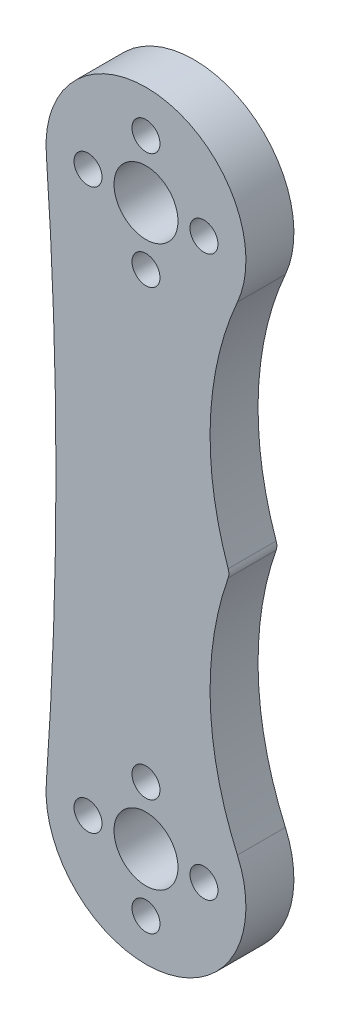
ISO-10303-21;
HEADER;
FILE_DESCRIPTION(('STEP AP214'),'2;1');
FILE_NAME('part.step','',(''),(''),'','','');
FILE_SCHEMA(('AUTOMOTIVE_DESIGN { 1 0 10303 214 1 1 1 1 }'));
ENDSEC;
DATA;
#1=APPLICATION_CONTEXT('core data for automotive mechanical design processes');
#2=APPLICATION_PROTOCOL_DEFINITION('international standard','automotive_design',2000,#1);
#3=PRODUCT_CONTEXT('',#1,'mechanical');
#4=PRODUCT('Part','Part','',(#3));
#5=PRODUCT_RELATED_PRODUCT_CATEGORY('part','',(#4));
#6=PRODUCT_DEFINITION_FORMATION('','',#4);
#7=PRODUCT_DEFINITION_CONTEXT('part definition',#1,'design');
#8=PRODUCT_DEFINITION('design','',#6,#7);
#9=PRODUCT_DEFINITION_SHAPE('','',#8);
#10=(LENGTH_UNIT() NAMED_UNIT(*) SI_UNIT(.MILLI.,.METRE.));
#11=(NAMED_UNIT(*) PLANE_ANGLE_UNIT() SI_UNIT($,.RADIAN.));
#12=(NAMED_UNIT(*) SI_UNIT($,.STERADIAN.) SOLID_ANGLE_UNIT());
#13=UNCERTAINTY_MEASURE_WITH_UNIT(LENGTH_MEASURE(1.E-05),#10,'distance_accuracy_value','');
#14=(GEOMETRIC_REPRESENTATION_CONTEXT(3) GLOBAL_UNCERTAINTY_ASSIGNED_CONTEXT((#13)) GLOBAL_UNIT_ASSIGNED_CONTEXT((#10,
#11,#12)) REPRESENTATION_CONTEXT('',''));
#15=CARTESIAN_POINT('',(0.,0.,0.));
#16=DIRECTION('',(0.,0.,1.));
#17=DIRECTION('',(1.,0.,0.));
#18=AXIS2_PLACEMENT_3D('',#15,#16,#17);
#19=CARTESIAN_POINT('',(-492.458190266202,35.,6.));
#20=DIRECTION('',(0.,0.,-1.));
#21=DIRECTION('',(-1.,0.,0.));
#22=AXIS2_PLACEMENT_3D('',#19,#20,#21);
#23=CYLINDRICAL_SURFACE('',#22,481.200383998497);
#24=CARTESIAN_POINT('',(-492.458190266202,35.,0.));
#25=DIRECTION('',(0.,0.,1.));
#26=DIRECTION('',(1.,0.,0.));
#27=AXIS2_PLACEMENT_3D('',#24,#25,#26);
#28=CIRCLE('',#27,481.200383998497);
#29=CARTESIAN_POINT('',(-12.4685488969485,0.886164998407885,0.));
#30=VERTEX_POINT('',#29);
#31=CARTESIAN_POINT('',(-12.4685488969485,69.1138350015921,0.));
#32=VERTEX_POINT('',#31);
#33=EDGE_CURVE('E115',#30,#32,#28,.T.);
#34=ORIENTED_EDGE('',*,*,#33,.F.);
#35=DIRECTION('',(0.,0.,-1.));
#36=VECTOR('',#35,1.);
#37=CARTESIAN_POINT('',(-12.4685488969485,0.886164998407885,6.));
#38=LINE('',#37,#36);
#39=CARTESIAN_POINT('',(-12.4685488969485,0.886164998407885,6.));
#40=VERTEX_POINT('',#39);
#41=EDGE_CURVE('E11',#40,#30,#38,.T.);
#42=ORIENTED_EDGE('',*,*,#41,.F.);
#43=CARTESIAN_POINT('',(-492.458190266202,35.,6.));
#44=DIRECTION('',(0.,0.,1.));
#45=DIRECTION('',(1.,0.,0.));
#46=AXIS2_PLACEMENT_3D('',#43,#44,#45);
#47=CIRCLE('',#46,481.200383998497);
#48=CARTESIAN_POINT('',(-12.4685488969485,69.1138350015921,6.));
#49=VERTEX_POINT('',#48);
#50=EDGE_CURVE('E130',#40,#49,#47,.T.);
#51=ORIENTED_EDGE('',*,*,#50,.T.);
#52=DIRECTION('',(0.,0.,-1.));
#53=VECTOR('',#52,1.);
#54=CARTESIAN_POINT('',(-12.4685488969485,69.1138350015921,6.));
#55=LINE('',#54,#53);
#56=EDGE_CURVE('E78',#49,#32,#55,.T.);
#57=ORIENTED_EDGE('',*,*,#56,.T.);
#58=EDGE_LOOP('',(#34,#42,#51,#57));
#59=FACE_BOUND('',#58,.T.);
#60=ADVANCED_FACE('F34',(#59),#23,.F.);
#61=CARTESIAN_POINT('',(0.,0.,6.));
#62=DIRECTION('',(0.,0.,-1.));
#63=DIRECTION('',(-1.,0.,0.));
#64=AXIS2_PLACEMENT_3D('',#61,#62,#63);
#65=CYLINDRICAL_SURFACE('',#64,12.5);
#66=CARTESIAN_POINT('',(0.,0.,0.));
#67=DIRECTION('',(0.,0.,1.));
#68=DIRECTION('',(1.,0.,0.));
#69=AXIS2_PLACEMENT_3D('',#66,#67,#68);
#70=CIRCLE('',#69,12.5);
#71=CARTESIAN_POINT('',(11.432131406701,5.05533099805747,0.));
#72=VERTEX_POINT('',#71);
#73=EDGE_CURVE('E118',#30,#72,#70,.T.);
#74=ORIENTED_EDGE('',*,*,#73,.T.);
#75=DIRECTION('',(0.,0.,-1.));
#76=VECTOR('',#75,1.);
#77=CARTESIAN_POINT('',(11.432131406701,5.05533099805747,6.));
#78=LINE('',#77,#76);
#79=CARTESIAN_POINT('',(11.432131406701,5.05533099805747,6.));
#80=VERTEX_POINT('',#79);
#81=EDGE_CURVE('E42',#80,#72,#78,.T.);
#82=ORIENTED_EDGE('',*,*,#81,.F.);
#83=CARTESIAN_POINT('',(0.,0.,6.));
#84=DIRECTION('',(0.,0.,1.));
#85=DIRECTION('',(1.,0.,0.));
#86=AXIS2_PLACEMENT_3D('',#83,#84,#85);
#87=CIRCLE('',#86,12.5);
#88=EDGE_CURVE('E143',#40,#80,#87,.T.);
#89=ORIENTED_EDGE('',*,*,#88,.F.);
#90=ORIENTED_EDGE('',*,*,#41,.T.);
#91=EDGE_LOOP('',(#74,#82,#89,#90));
#92=FACE_BOUND('',#91,.T.);
#93=ADVANCED_FACE('F139',(#92),#65,.T.);
#94=CARTESIAN_POINT('',(48.0149519081442,21.2323901918414,6.));
#95=DIRECTION('',(0.,0.,-1.));
#96=DIRECTION('',(-1.,0.,0.));
#97=AXIS2_PLACEMENT_3D('',#94,#95,#96);
#98=CYLINDRICAL_SURFACE('',#97,40.);
#99=CARTESIAN_POINT('',(48.0149519081442,21.2323901918414,0.));
#100=DIRECTION('',(0.,0.,1.));
#101=DIRECTION('',(1.,0.,0.));
#102=AXIS2_PLACEMENT_3D('',#99,#100,#101);
#103=CIRCLE('',#102,40.);
#104=CARTESIAN_POINT('',(10.2802531731858,34.5023755491027,0.));
#105=VERTEX_POINT('',#104);
#106=EDGE_CURVE('E122',#105,#72,#103,.T.);
#107=ORIENTED_EDGE('',*,*,#106,.F.);
#108=DIRECTION('',(0.,0.,-1.));
#109=VECTOR('',#108,1.);
#110=CARTESIAN_POINT('',(10.2802531731858,34.5023755491027,6.));
#111=LINE('',#110,#109);
#112=CARTESIAN_POINT('',(10.2802531731858,34.5023755491027,6.));
#113=VERTEX_POINT('',#112);
#114=EDGE_CURVE('E108',#113,#105,#111,.T.);
#115=ORIENTED_EDGE('',*,*,#114,.F.);
#116=CARTESIAN_POINT('',(48.0149519081442,21.2323901918414,6.));
#117=DIRECTION('',(0.,0.,1.));
#118=DIRECTION('',(1.,0.,0.));
#119=AXIS2_PLACEMENT_3D('',#116,#117,#118);
#120=CIRCLE('',#119,40.);
#121=EDGE_CURVE('E97',#113,#80,#120,.T.);
#122=ORIENTED_EDGE('',*,*,#121,.T.);
#123=ORIENTED_EDGE('',*,*,#81,.T.);
#124=EDGE_LOOP('',(#107,#115,#122,#123));
#125=FACE_BOUND('',#124,.T.);
#126=ADVANCED_FACE('F136',(#125),#98,.F.);
#127=CARTESIAN_POINT('',(8.86520197062487,35.,6.));
#128=DIRECTION('',(0.,0.,-1.));
#129=DIRECTION('',(-1.,0.,0.));
#130=AXIS2_PLACEMENT_3D('',#127,#128,#129);
#131=CYLINDRICAL_SURFACE('',#130,1.5);
#132=CARTESIAN_POINT('',(8.86520197062487,35.,0.));
#133=DIRECTION('',(0.,0.,1.));
#134=DIRECTION('',(1.,0.,0.));
#135=AXIS2_PLACEMENT_3D('',#132,#133,#134);
#136=CIRCLE('',#135,1.5);
#137=CARTESIAN_POINT('',(10.2802531731858,35.4976244508973,0.));
#138=VERTEX_POINT('',#137);
#139=EDGE_CURVE('E104',#105,#138,#136,.T.);
#140=ORIENTED_EDGE('',*,*,#139,.T.);
#141=DIRECTION('',(0.,0.,-1.));
#142=VECTOR('',#141,1.);
#143=CARTESIAN_POINT('',(10.2802531731858,35.4976244508973,6.));
#144=LINE('',#143,#142);
#145=CARTESIAN_POINT('',(10.2802531731858,35.4976244508973,6.));
#146=VERTEX_POINT('',#145);
#147=EDGE_CURVE('E101',#146,#138,#144,.T.);
#148=ORIENTED_EDGE('',*,*,#147,.F.);
#149=CARTESIAN_POINT('',(8.86520197062487,35.,6.));
#150=DIRECTION('',(0.,0.,1.));
#151=DIRECTION('',(1.,0.,0.));
#152=AXIS2_PLACEMENT_3D('',#149,#150,#151);
#153=CIRCLE('',#152,1.5);
#154=EDGE_CURVE('E91',#113,#146,#153,.T.);
#155=ORIENTED_EDGE('',*,*,#154,.F.);
#156=ORIENTED_EDGE('',*,*,#114,.T.);
#157=EDGE_LOOP('',(#140,#148,#155,#156));
#158=FACE_BOUND('',#157,.T.);
#159=ADVANCED_FACE('F102',(#158),#131,.T.);
#160=CARTESIAN_POINT('',(48.0149519081442,48.7676098081586,6.));
#161=DIRECTION('',(0.,0.,-1.));
#162=DIRECTION('',(-1.,0.,0.));
#163=AXIS2_PLACEMENT_3D('',#160,#161,#162);
#164=CYLINDRICAL_SURFACE('',#163,40.);
#165=CARTESIAN_POINT('',(48.0149519081442,48.7676098081586,0.));
#166=DIRECTION('',(0.,0.,1.));
#167=DIRECTION('',(1.,0.,0.));
#168=AXIS2_PLACEMENT_3D('',#165,#166,#167);
#169=CIRCLE('',#168,40.);
#170=CARTESIAN_POINT('',(11.432131406701,64.9446690019425,0.));
#171=VERTEX_POINT('',#170);
#172=EDGE_CURVE('E126',#171,#138,#169,.T.);
#173=ORIENTED_EDGE('',*,*,#172,.F.);
#174=DIRECTION('',(0.,0.,-1.));
#175=VECTOR('',#174,1.);
#176=CARTESIAN_POINT('',(11.432131406701,64.9446690019425,6.));
#177=LINE('',#176,#175);
#178=CARTESIAN_POINT('',(11.432131406701,64.9446690019425,6.));
#179=VERTEX_POINT('',#178);
#180=EDGE_CURVE('E71',#179,#171,#177,.T.);
#181=ORIENTED_EDGE('',*,*,#180,.F.);
#182=CARTESIAN_POINT('',(48.0149519081442,48.7676098081586,6.));
#183=DIRECTION('',(0.,0.,1.));
#184=DIRECTION('',(1.,0.,0.));
#185=AXIS2_PLACEMENT_3D('',#182,#183,#184);
#186=CIRCLE('',#185,40.);
#187=EDGE_CURVE('E95',#179,#146,#186,.T.);
#188=ORIENTED_EDGE('',*,*,#187,.T.);
#189=ORIENTED_EDGE('',*,*,#147,.T.);
#190=EDGE_LOOP('',(#173,#181,#188,#189));
#191=FACE_BOUND('',#190,.T.);
#192=ADVANCED_FACE('F110',(#191),#164,.F.);
#193=CARTESIAN_POINT('',(0.,70.,6.));
#194=DIRECTION('',(0.,0.,-1.));
#195=DIRECTION('',(-1.,0.,0.));
#196=AXIS2_PLACEMENT_3D('',#193,#194,#195);
#197=CYLINDRICAL_SURFACE('',#196,12.5);
#198=CARTESIAN_POINT('',(0.,70.,0.));
#199=DIRECTION('',(0.,0.,1.));
#200=DIRECTION('',(1.,0.,0.));
#201=AXIS2_PLACEMENT_3D('',#198,#199,#200);
#202=CIRCLE('',#201,12.5);
#203=EDGE_CURVE('E128',#171,#32,#202,.T.);
#204=ORIENTED_EDGE('',*,*,#203,.T.);
#205=ORIENTED_EDGE('',*,*,#56,.F.);
#206=CARTESIAN_POINT('',(0.,70.,6.));
#207=DIRECTION('',(0.,0.,1.));
#208=DIRECTION('',(1.,0.,0.));
#209=AXIS2_PLACEMENT_3D('',#206,#207,#208);
#210=CIRCLE('',#209,12.5);
#211=EDGE_CURVE('E50',#179,#49,#210,.T.);
#212=ORIENTED_EDGE('',*,*,#211,.F.);
#213=ORIENTED_EDGE('',*,*,#180,.T.);
#214=EDGE_LOOP('',(#204,#205,#212,#213));
#215=FACE_BOUND('',#214,.T.);
#216=ADVANCED_FACE('F142',(#215),#197,.T.);
#217=CARTESIAN_POINT('',(0.,0.,6.));
#218=DIRECTION('',(0.,0.,1.));
#219=DIRECTION('',(1.,0.,0.));
#220=AXIS2_PLACEMENT_3D('',#217,#218,#219);
#221=PLANE('',#220);
#222=CARTESIAN_POINT('',(0.,62.75,6.));
#223=DIRECTION('',(0.,0.,1.));
#224=DIRECTION('',(1.,0.,0.));
#225=AXIS2_PLACEMENT_3D('',#222,#223,#224);
#226=CIRCLE('',#225,1.75);
#227=CARTESIAN_POINT('',(1.75,62.75,6.));
#228=VERTEX_POINT('',#227);
#229=EDGE_CURVE('E177',#228,#228,#226,.T.);
#230=ORIENTED_EDGE('',*,*,#229,.F.);
#231=EDGE_LOOP('',(#230));
#232=FACE_BOUND('',#231,.T.);
#233=CARTESIAN_POINT('',(7.25000000000001,70.,6.));
#234=DIRECTION('',(0.,0.,1.));
#235=DIRECTION('',(1.,0.,0.));
#236=AXIS2_PLACEMENT_3D('',#233,#234,#235);
#237=CIRCLE('',#236,1.75);
#238=CARTESIAN_POINT('',(9.00000000000001,70.,6.));
#239=VERTEX_POINT('',#238);
#240=EDGE_CURVE('E184',#239,#239,#237,.T.);
#241=ORIENTED_EDGE('',*,*,#240,.F.);
#242=EDGE_LOOP('',(#241));
#243=FACE_BOUND('',#242,.T.);
#244=CARTESIAN_POINT('',(-7.2499999999998,-2.06057393370429E-13,6.));
#245=DIRECTION('',(0.,0.,1.));
#246=DIRECTION('',(1.,0.,0.));
#247=AXIS2_PLACEMENT_3D('',#244,#245,#246);
#248=CIRCLE('',#247,1.75);
#249=CARTESIAN_POINT('',(-5.4999999999998,-2.06057393370429E-13,6.));
#250=VERTEX_POINT('',#249);
#251=EDGE_CURVE('E190',#250,#250,#248,.T.);
#252=ORIENTED_EDGE('',*,*,#251,.F.);
#253=EDGE_LOOP('',(#252));
#254=FACE_BOUND('',#253,.T.);
#255=CARTESIAN_POINT('',(4.10339048882094E-13,-7.25,6.));
#256=DIRECTION('',(0.,0.,1.));
#257=DIRECTION('',(1.,0.,0.));
#258=AXIS2_PLACEMENT_3D('',#255,#256,#257);
#259=CIRCLE('',#258,1.75);
#260=CARTESIAN_POINT('',(1.75000000000041,-7.25,6.));
#261=VERTEX_POINT('',#260);
#262=EDGE_CURVE('E196',#261,#261,#259,.T.);
#263=ORIENTED_EDGE('',*,*,#262,.F.);
#264=EDGE_LOOP('',(#263));
#265=FACE_BOUND('',#264,.T.);
#266=CARTESIAN_POINT('',(0.,0.,6.));
#267=DIRECTION('',(0.,0.,1.));
#268=DIRECTION('',(1.,0.,0.));
#269=AXIS2_PLACEMENT_3D('',#266,#267,#268);
#270=CIRCLE('',#269,4.);
#271=CARTESIAN_POINT('',(4.,0.,6.));
#272=VERTEX_POINT('',#271);
#273=EDGE_CURVE('E160',#272,#272,#270,.T.);
#274=ORIENTED_EDGE('',*,*,#273,.F.);
#275=EDGE_LOOP('',(#274));
#276=FACE_BOUND('',#275,.T.);
#277=CARTESIAN_POINT('',(0.,7.25,6.));
#278=DIRECTION('',(0.,0.,1.));
#279=DIRECTION('',(1.,0.,0.));
#280=AXIS2_PLACEMENT_3D('',#277,#278,#279);
#281=CIRCLE('',#280,1.75);
#282=CARTESIAN_POINT('',(1.75,7.25,6.));
#283=VERTEX_POINT('',#282);
#284=EDGE_CURVE('E153',#283,#283,#281,.T.);
#285=ORIENTED_EDGE('',*,*,#284,.F.);
#286=EDGE_LOOP('',(#285));
#287=FACE_BOUND('',#286,.T.);
#288=CARTESIAN_POINT('',(0.,77.25,6.));
#289=DIRECTION('',(0.,0.,1.));
#290=DIRECTION('',(1.,0.,0.));
#291=AXIS2_PLACEMENT_3D('',#288,#289,#290);
#292=CIRCLE('',#291,1.75);
#293=CARTESIAN_POINT('',(1.75,77.25,6.));
#294=VERTEX_POINT('',#293);
#295=EDGE_CURVE('E172',#294,#294,#292,.T.);
#296=ORIENTED_EDGE('',*,*,#295,.F.);
#297=EDGE_LOOP('',(#296));
#298=FACE_BOUND('',#297,.T.);
#299=CARTESIAN_POINT('',(7.25000000000021,2.05169524441047E-13,6.));
#300=DIRECTION('',(0.,0.,1.));
#301=DIRECTION('',(1.,0.,0.));
#302=AXIS2_PLACEMENT_3D('',#299,#300,#301);
#303=CIRCLE('',#302,1.75);
#304=CARTESIAN_POINT('',(9.00000000000021,2.05169524441047E-13,6.));
#305=VERTEX_POINT('',#304);
#306=EDGE_CURVE('E165',#305,#305,#303,.T.);
#307=ORIENTED_EDGE('',*,*,#306,.F.);
#308=EDGE_LOOP('',(#307));
#309=FACE_BOUND('',#308,.T.);
#310=CARTESIAN_POINT('',(-7.25000000000001,70.,6.));
#311=DIRECTION('',(0.,0.,1.));
#312=DIRECTION('',(1.,0.,0.));
#313=AXIS2_PLACEMENT_3D('',#310,#311,#312);
#314=CIRCLE('',#313,1.75);
#315=CARTESIAN_POINT('',(-5.50000000000001,70.,6.));
#316=VERTEX_POINT('',#315);
#317=EDGE_CURVE('E201',#316,#316,#314,.T.);
#318=ORIENTED_EDGE('',*,*,#317,.F.);
#319=EDGE_LOOP('',(#318));
#320=FACE_BOUND('',#319,.T.);
#321=CARTESIAN_POINT('',(0.,70.,6.));
#322=DIRECTION('',(0.,0.,1.));
#323=DIRECTION('',(1.,0.,0.));
#324=AXIS2_PLACEMENT_3D('',#321,#322,#323);
#325=CIRCLE('',#324,4.);
#326=CARTESIAN_POINT('',(4.,70.,6.));
#327=VERTEX_POINT('',#326);
#328=EDGE_CURVE('E147',#327,#327,#325,.T.);
#329=ORIENTED_EDGE('',*,*,#328,.F.);
#330=EDGE_LOOP('',(#329));
#331=FACE_BOUND('',#330,.T.);
#332=ORIENTED_EDGE('',*,*,#50,.F.);
#333=ORIENTED_EDGE('',*,*,#88,.T.);
#334=ORIENTED_EDGE('',*,*,#121,.F.);
#335=ORIENTED_EDGE('',*,*,#154,.T.);
#336=ORIENTED_EDGE('',*,*,#187,.F.);
#337=ORIENTED_EDGE('',*,*,#211,.T.);
#338=EDGE_LOOP('',(#332,#333,#334,#335,#336,#337));
#339=FACE_BOUND('',#338,.T.);
#340=ADVANCED_FACE('F93',(#232,#243,#254,#265,#276,#287,#298,#309,#320,#331,#339),#221,.T.);
#341=CARTESIAN_POINT('',(0.,0.,0.));
#342=DIRECTION('',(0.,0.,1.));
#343=DIRECTION('',(1.,0.,0.));
#344=AXIS2_PLACEMENT_3D('',#341,#342,#343);
#345=PLANE('',#344);
#346=CARTESIAN_POINT('',(0.,62.75,0.));
#347=DIRECTION('',(0.,0.,1.));
#348=DIRECTION('',(1.,0.,0.));
#349=AXIS2_PLACEMENT_3D('',#346,#347,#348);
#350=CIRCLE('',#349,1.75);
#351=CARTESIAN_POINT('',(1.75,62.75,0.));
#352=VERTEX_POINT('',#351);
#353=EDGE_CURVE('E180',#352,#352,#350,.T.);
#354=ORIENTED_EDGE('',*,*,#353,.T.);
#355=EDGE_LOOP('',(#354));
#356=FACE_BOUND('',#355,.T.);
#357=CARTESIAN_POINT('',(7.25000000000001,70.,0.));
#358=DIRECTION('',(0.,0.,1.));
#359=DIRECTION('',(1.,0.,0.));
#360=AXIS2_PLACEMENT_3D('',#357,#358,#359);
#361=CIRCLE('',#360,1.75);
#362=CARTESIAN_POINT('',(9.00000000000001,70.,0.));
#363=VERTEX_POINT('',#362);
#364=EDGE_CURVE('E187',#363,#363,#361,.T.);
#365=ORIENTED_EDGE('',*,*,#364,.T.);
#366=EDGE_LOOP('',(#365));
#367=FACE_BOUND('',#366,.T.);
#368=CARTESIAN_POINT('',(-7.2499999999998,-2.06057393370429E-13,0.));
#369=DIRECTION('',(0.,0.,1.));
#370=DIRECTION('',(1.,0.,0.));
#371=AXIS2_PLACEMENT_3D('',#368,#369,#370);
#372=CIRCLE('',#371,1.75);
#373=CARTESIAN_POINT('',(-5.4999999999998,-2.06057393370429E-13,0.));
#374=VERTEX_POINT('',#373);
#375=EDGE_CURVE('E193',#374,#374,#372,.T.);
#376=ORIENTED_EDGE('',*,*,#375,.T.);
#377=EDGE_LOOP('',(#376));
#378=FACE_BOUND('',#377,.T.);
#379=CARTESIAN_POINT('',(4.10339048882094E-13,-7.25,0.));
#380=DIRECTION('',(0.,0.,1.));
#381=DIRECTION('',(1.,0.,0.));
#382=AXIS2_PLACEMENT_3D('',#379,#380,#381);
#383=CIRCLE('',#382,1.75);
#384=CARTESIAN_POINT('',(1.75000000000041,-7.25,0.));
#385=VERTEX_POINT('',#384);
#386=EDGE_CURVE('E169',#385,#385,#383,.T.);
#387=ORIENTED_EDGE('',*,*,#386,.T.);
#388=EDGE_LOOP('',(#387));
#389=FACE_BOUND('',#388,.T.);
#390=CARTESIAN_POINT('',(0.,0.,0.));
#391=DIRECTION('',(0.,0.,1.));
#392=DIRECTION('',(1.,0.,0.));
#393=AXIS2_PLACEMENT_3D('',#390,#391,#392);
#394=CIRCLE('',#393,4.);
#395=CARTESIAN_POINT('',(4.,0.,0.));
#396=VERTEX_POINT('',#395);
#397=EDGE_CURVE('E150',#396,#396,#394,.T.);
#398=ORIENTED_EDGE('',*,*,#397,.T.);
#399=EDGE_LOOP('',(#398));
#400=FACE_BOUND('',#399,.T.);
#401=CARTESIAN_POINT('',(0.,7.25,0.));
#402=DIRECTION('',(0.,0.,1.));
#403=DIRECTION('',(1.,0.,0.));
#404=AXIS2_PLACEMENT_3D('',#401,#402,#403);
#405=CIRCLE('',#404,1.75);
#406=CARTESIAN_POINT('',(1.75,7.25,0.));
#407=VERTEX_POINT('',#406);
#408=EDGE_CURVE('E156',#407,#407,#405,.T.);
#409=ORIENTED_EDGE('',*,*,#408,.T.);
#410=EDGE_LOOP('',(#409));
#411=FACE_BOUND('',#410,.T.);
#412=CARTESIAN_POINT('',(0.,77.25,0.));
#413=DIRECTION('',(0.,0.,1.));
#414=DIRECTION('',(1.,0.,0.));
#415=AXIS2_PLACEMENT_3D('',#412,#413,#414);
#416=CIRCLE('',#415,1.75);
#417=CARTESIAN_POINT('',(1.75,77.25,0.));
#418=VERTEX_POINT('',#417);
#419=EDGE_CURVE('E157',#418,#418,#416,.T.);
#420=ORIENTED_EDGE('',*,*,#419,.T.);
#421=EDGE_LOOP('',(#420));
#422=FACE_BOUND('',#421,.T.);
#423=CARTESIAN_POINT('',(7.25000000000021,2.05169524441047E-13,0.));
#424=DIRECTION('',(0.,0.,1.));
#425=DIRECTION('',(1.,0.,0.));
#426=AXIS2_PLACEMENT_3D('',#423,#424,#425);
#427=CIRCLE('',#426,1.75);
#428=CARTESIAN_POINT('',(9.00000000000021,2.05169524441047E-13,0.));
#429=VERTEX_POINT('',#428);
#430=EDGE_CURVE('E168',#429,#429,#427,.T.);
#431=ORIENTED_EDGE('',*,*,#430,.T.);
#432=EDGE_LOOP('',(#431));
#433=FACE_BOUND('',#432,.T.);
#434=CARTESIAN_POINT('',(-7.25000000000001,70.,0.));
#435=DIRECTION('',(0.,0.,1.));
#436=DIRECTION('',(1.,0.,0.));
#437=AXIS2_PLACEMENT_3D('',#434,#435,#436);
#438=CIRCLE('',#437,1.75);
#439=CARTESIAN_POINT('',(-5.50000000000001,70.,0.));
#440=VERTEX_POINT('',#439);
#441=EDGE_CURVE('E181',#440,#440,#438,.T.);
#442=ORIENTED_EDGE('',*,*,#441,.T.);
#443=EDGE_LOOP('',(#442));
#444=FACE_BOUND('',#443,.T.);
#445=CARTESIAN_POINT('',(0.,70.,0.));
#446=DIRECTION('',(0.,0.,1.));
#447=DIRECTION('',(1.,0.,0.));
#448=AXIS2_PLACEMENT_3D('',#445,#446,#447);
#449=CIRCLE('',#448,4.);
#450=CARTESIAN_POINT('',(4.,70.,0.));
#451=VERTEX_POINT('',#450);
#452=EDGE_CURVE('E119',#451,#451,#449,.T.);
#453=ORIENTED_EDGE('',*,*,#452,.T.);
#454=EDGE_LOOP('',(#453));
#455=FACE_BOUND('',#454,.T.);
#456=ORIENTED_EDGE('',*,*,#33,.T.);
#457=ORIENTED_EDGE('',*,*,#203,.F.);
#458=ORIENTED_EDGE('',*,*,#172,.T.);
#459=ORIENTED_EDGE('',*,*,#139,.F.);
#460=ORIENTED_EDGE('',*,*,#106,.T.);
#461=ORIENTED_EDGE('',*,*,#73,.F.);
#462=EDGE_LOOP('',(#456,#457,#458,#459,#460,#461));
#463=FACE_BOUND('',#462,.T.);
#464=ADVANCED_FACE('F141',(#356,#367,#378,#389,#400,#411,#422,#433,#444,#455,#463),#345,.F.);
#465=CARTESIAN_POINT('',(0.,70.,0.));
#466=DIRECTION('',(0.,0.,1.));
#467=DIRECTION('',(1.,0.,0.));
#468=AXIS2_PLACEMENT_3D('',#465,#466,#467);
#469=CYLINDRICAL_SURFACE('',#468,4.);
#470=ORIENTED_EDGE('',*,*,#452,.F.);
#471=EDGE_LOOP('',(#470));
#472=FACE_BOUND('',#471,.T.);
#473=ORIENTED_EDGE('',*,*,#328,.T.);
#474=EDGE_LOOP('',(#473));
#475=FACE_BOUND('',#474,.T.);
#476=ADVANCED_FACE('F213',(#472,#475),#469,.F.);
#477=CARTESIAN_POINT('',(-7.25000000000001,70.,0.));
#478=DIRECTION('',(0.,0.,1.));
#479=DIRECTION('',(1.,0.,0.));
#480=AXIS2_PLACEMENT_3D('',#477,#478,#479);
#481=CYLINDRICAL_SURFACE('',#480,1.75);
#482=ORIENTED_EDGE('',*,*,#441,.F.);
#483=EDGE_LOOP('',(#482));
#484=FACE_BOUND('',#483,.T.);
#485=ORIENTED_EDGE('',*,*,#317,.T.);
#486=EDGE_LOOP('',(#485));
#487=FACE_BOUND('',#486,.T.);
#488=ADVANCED_FACE('F209',(#484,#487),#481,.F.);
#489=CARTESIAN_POINT('',(7.25000000000021,2.05169524441047E-13,0.));
#490=DIRECTION('',(0.,0.,1.));
#491=DIRECTION('',(1.,0.,0.));
#492=AXIS2_PLACEMENT_3D('',#489,#490,#491);
#493=CYLINDRICAL_SURFACE('',#492,1.75);
#494=ORIENTED_EDGE('',*,*,#430,.F.);
#495=EDGE_LOOP('',(#494));
#496=FACE_BOUND('',#495,.T.);
#497=ORIENTED_EDGE('',*,*,#306,.T.);
#498=EDGE_LOOP('',(#497));
#499=FACE_BOUND('',#498,.T.);
#500=ADVANCED_FACE('F212',(#496,#499),#493,.F.);
#501=CARTESIAN_POINT('',(0.,77.25,0.));
#502=DIRECTION('',(0.,0.,1.));
#503=DIRECTION('',(1.,0.,0.));
#504=AXIS2_PLACEMENT_3D('',#501,#502,#503);
#505=CYLINDRICAL_SURFACE('',#504,1.75);
#506=ORIENTED_EDGE('',*,*,#419,.F.);
#507=EDGE_LOOP('',(#506));
#508=FACE_BOUND('',#507,.T.);
#509=ORIENTED_EDGE('',*,*,#295,.T.);
#510=EDGE_LOOP('',(#509));
#511=FACE_BOUND('',#510,.T.);
#512=ADVANCED_FACE('F279',(#508,#511),#505,.F.);
#513=CARTESIAN_POINT('',(0.,7.25,0.));
#514=DIRECTION('',(0.,0.,1.));
#515=DIRECTION('',(1.,0.,0.));
#516=AXIS2_PLACEMENT_3D('',#513,#514,#515);
#517=CYLINDRICAL_SURFACE('',#516,1.75);
#518=ORIENTED_EDGE('',*,*,#408,.F.);
#519=EDGE_LOOP('',(#518));
#520=FACE_BOUND('',#519,.T.);
#521=ORIENTED_EDGE('',*,*,#284,.T.);
#522=EDGE_LOOP('',(#521));
#523=FACE_BOUND('',#522,.T.);
#524=ADVANCED_FACE('F289',(#520,#523),#517,.F.);
#525=CARTESIAN_POINT('',(0.,0.,0.));
#526=DIRECTION('',(0.,0.,1.));
#527=DIRECTION('',(1.,0.,0.));
#528=AXIS2_PLACEMENT_3D('',#525,#526,#527);
#529=CYLINDRICAL_SURFACE('',#528,4.);
#530=ORIENTED_EDGE('',*,*,#397,.F.);
#531=EDGE_LOOP('',(#530));
#532=FACE_BOUND('',#531,.T.);
#533=ORIENTED_EDGE('',*,*,#273,.T.);
#534=EDGE_LOOP('',(#533));
#535=FACE_BOUND('',#534,.T.);
#536=ADVANCED_FACE('F299',(#532,#535),#529,.F.);
#537=CARTESIAN_POINT('',(4.10339048882094E-13,-7.25,0.));
#538=DIRECTION('',(0.,0.,1.));
#539=DIRECTION('',(1.,0.,0.));
#540=AXIS2_PLACEMENT_3D('',#537,#538,#539);
#541=CYLINDRICAL_SURFACE('',#540,1.75);
#542=ORIENTED_EDGE('',*,*,#386,.F.);
#543=EDGE_LOOP('',(#542));
#544=FACE_BOUND('',#543,.T.);
#545=ORIENTED_EDGE('',*,*,#262,.T.);
#546=EDGE_LOOP('',(#545));
#547=FACE_BOUND('',#546,.T.);
#548=ADVANCED_FACE('F308',(#544,#547),#541,.F.);
#549=CARTESIAN_POINT('',(-7.2499999999998,-2.06057393370429E-13,0.));
#550=DIRECTION('',(0.,0.,1.));
#551=DIRECTION('',(1.,0.,0.));
#552=AXIS2_PLACEMENT_3D('',#549,#550,#551);
#553=CYLINDRICAL_SURFACE('',#552,1.75);
#554=ORIENTED_EDGE('',*,*,#375,.F.);
#555=EDGE_LOOP('',(#554));
#556=FACE_BOUND('',#555,.T.);
#557=ORIENTED_EDGE('',*,*,#251,.T.);
#558=EDGE_LOOP('',(#557));
#559=FACE_BOUND('',#558,.T.);
#560=ADVANCED_FACE('F318',(#556,#559),#553,.F.);
#561=CARTESIAN_POINT('',(7.25000000000001,70.,0.));
#562=DIRECTION('',(0.,0.,1.));
#563=DIRECTION('',(1.,0.,0.));
#564=AXIS2_PLACEMENT_3D('',#561,#562,#563);
#565=CYLINDRICAL_SURFACE('',#564,1.75);
#566=ORIENTED_EDGE('',*,*,#364,.F.);
#567=EDGE_LOOP('',(#566));
#568=FACE_BOUND('',#567,.T.);
#569=ORIENTED_EDGE('',*,*,#240,.T.);
#570=EDGE_LOOP('',(#569));
#571=FACE_BOUND('',#570,.T.);
#572=ADVANCED_FACE('F328',(#568,#571),#565,.F.);
#573=CARTESIAN_POINT('',(0.,62.75,0.));
#574=DIRECTION('',(0.,0.,1.));
#575=DIRECTION('',(1.,0.,0.));
#576=AXIS2_PLACEMENT_3D('',#573,#574,#575);
#577=CYLINDRICAL_SURFACE('',#576,1.75);
#578=ORIENTED_EDGE('',*,*,#353,.F.);
#579=EDGE_LOOP('',(#578));
#580=FACE_BOUND('',#579,.T.);
#581=ORIENTED_EDGE('',*,*,#229,.T.);
#582=EDGE_LOOP('',(#581));
#583=FACE_BOUND('',#582,.T.);
#584=ADVANCED_FACE('F338',(#580,#583),#577,.F.);
#585=CLOSED_SHELL('',(#60,#93,#126,#159,#192,#216,#340,#464,#476,#488,#500,#512,#524,#536,#548,
#560,#572,#584));
#586=MANIFOLD_SOLID_BREP('B2',#585);
#587=ADVANCED_BREP_SHAPE_REPRESENTATION('',(#18,#586),#14);
#588=SHAPE_DEFINITION_REPRESENTATION(#9,#587);
ENDSEC;
END-ISO-10303-21;
